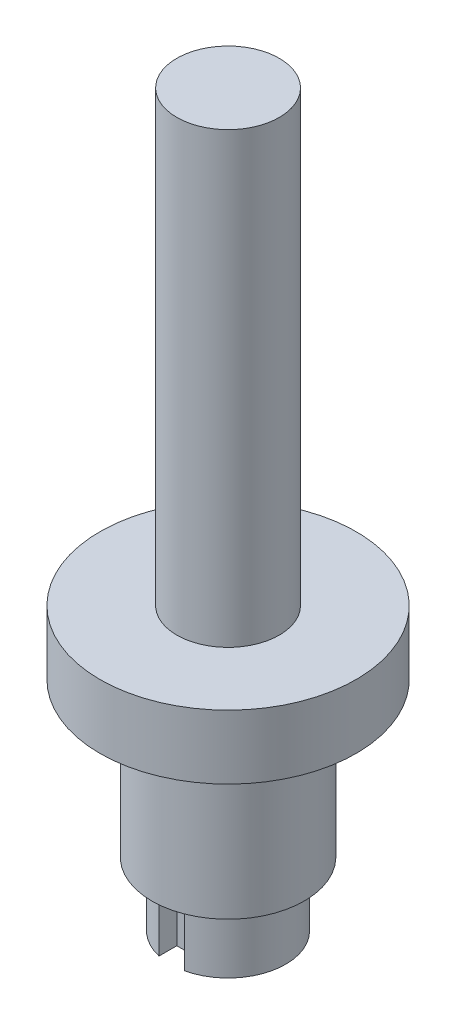
ISO-10303-21;
HEADER;
FILE_DESCRIPTION(('STEP AP214'),'2;1');
FILE_NAME('part.step','',(''),(''),'','','');
FILE_SCHEMA(('AUTOMOTIVE_DESIGN { 1 0 10303 214 1 1 1 1 }'));
ENDSEC;
DATA;
#1=APPLICATION_CONTEXT('core data for automotive mechanical design processes');
#2=APPLICATION_PROTOCOL_DEFINITION('international standard','automotive_design',2000,#1);
#3=PRODUCT_CONTEXT('',#1,'mechanical');
#4=PRODUCT('Part','Part','',(#3));
#5=PRODUCT_RELATED_PRODUCT_CATEGORY('part','',(#4));
#6=PRODUCT_DEFINITION_FORMATION('','',#4);
#7=PRODUCT_DEFINITION_CONTEXT('part definition',#1,'design');
#8=PRODUCT_DEFINITION('design','',#6,#7);
#9=PRODUCT_DEFINITION_SHAPE('','',#8);
#10=(LENGTH_UNIT() NAMED_UNIT(*) SI_UNIT(.MILLI.,.METRE.));
#11=(NAMED_UNIT(*) PLANE_ANGLE_UNIT() SI_UNIT($,.RADIAN.));
#12=(NAMED_UNIT(*) SI_UNIT($,.STERADIAN.) SOLID_ANGLE_UNIT());
#13=UNCERTAINTY_MEASURE_WITH_UNIT(LENGTH_MEASURE(1.E-05),#10,'distance_accuracy_value','');
#14=(GEOMETRIC_REPRESENTATION_CONTEXT(3) GLOBAL_UNCERTAINTY_ASSIGNED_CONTEXT((#13)) GLOBAL_UNIT_ASSIGNED_CONTEXT((#10,
#11,#12)) REPRESENTATION_CONTEXT('',''));
#15=CARTESIAN_POINT('',(0.,0.,0.));
#16=DIRECTION('',(0.,0.,1.));
#17=DIRECTION('',(1.,0.,0.));
#18=AXIS2_PLACEMENT_3D('',#15,#16,#17);
#19=CARTESIAN_POINT('',(0.,5.,0.));
#20=DIRECTION('',(0.,-1.,0.));
#21=DIRECTION('',(0.,0.,-1.));
#22=AXIS2_PLACEMENT_3D('',#19,#20,#21);
#23=CYLINDRICAL_SURFACE('',#22,4.5);
#24=CARTESIAN_POINT('',(0.,0.,0.));
#25=DIRECTION('',(0.,1.,0.));
#26=DIRECTION('',(0.,0.,1.));
#27=AXIS2_PLACEMENT_3D('',#24,#25,#26);
#28=CIRCLE('',#27,4.5);
#29=CARTESIAN_POINT('',(1.,0.,4.38748219369606));
#30=VERTEX_POINT('',#29);
#31=CARTESIAN_POINT('',(-1.,0.,4.38748219369606));
#32=VERTEX_POINT('',#31);
#33=EDGE_CURVE('E51',#30,#32,#28,.T.);
#34=ORIENTED_EDGE('',*,*,#33,.T.);
#35=DIRECTION('',(0.,-1.,0.));
#36=VECTOR('',#35,1.);
#37=CARTESIAN_POINT('',(-1.,5.,4.38748219369606));
#38=LINE('',#37,#36);
#39=CARTESIAN_POINT('',(-1.,5.,4.38748219369606));
#40=VERTEX_POINT('',#39);
#41=EDGE_CURVE('E71',#32,#40,#38,.F.);
#42=ORIENTED_EDGE('',*,*,#41,.T.);
#43=CARTESIAN_POINT('',(0.,5.,0.));
#44=DIRECTION('',(0.,1.,0.));
#45=DIRECTION('',(0.,0.,1.));
#46=AXIS2_PLACEMENT_3D('',#43,#44,#45);
#47=CIRCLE('',#46,4.5);
#48=CARTESIAN_POINT('',(1.,5.,4.38748219369606));
#49=VERTEX_POINT('',#48);
#50=EDGE_CURVE('E11',#49,#40,#47,.T.);
#51=ORIENTED_EDGE('',*,*,#50,.F.);
#52=DIRECTION('',(0.,-1.,0.));
#53=VECTOR('',#52,1.);
#54=CARTESIAN_POINT('',(1.,5.,4.38748219369606));
#55=LINE('',#54,#53);
#56=EDGE_CURVE('E122',#49,#30,#55,.T.);
#57=ORIENTED_EDGE('',*,*,#56,.T.);
#58=EDGE_LOOP('',(#34,#42,#51,#57));
#59=FACE_BOUND('',#58,.T.);
#60=ADVANCED_FACE('F48',(#59),#23,.T.);
#61=CARTESIAN_POINT('',(0.,0.,0.));
#62=DIRECTION('',(0.,1.,0.));
#63=DIRECTION('',(0.,0.,1.));
#64=AXIS2_PLACEMENT_3D('',#61,#62,#63);
#65=PLANE('',#64);
#66=CARTESIAN_POINT('',(0.,0.,0.));
#67=DIRECTION('',(0.,-1.,0.));
#68=DIRECTION('',(0.,0.,-1.));
#69=AXIS2_PLACEMENT_3D('',#66,#67,#68);
#70=CIRCLE('',#69,1.525);
#71=CARTESIAN_POINT('',(0.,0.,-1.525));
#72=VERTEX_POINT('',#71);
#73=EDGE_CURVE('E133',#72,#72,#70,.T.);
#74=ORIENTED_EDGE('',*,*,#73,.F.);
#75=EDGE_LOOP('',(#74));
#76=FACE_BOUND('',#75,.T.);
#77=DIRECTION('',(1.,0.,0.));
#78=VECTOR('',#77,1.);
#79=CARTESIAN_POINT('',(-1.,0.,3.));
#80=LINE('',#79,#78);
#81=CARTESIAN_POINT('',(-1.,0.,3.));
#82=VERTEX_POINT('',#81);
#83=CARTESIAN_POINT('',(1.,0.,3.));
#84=VERTEX_POINT('',#83);
#85=EDGE_CURVE('E63',#82,#84,#80,.T.);
#86=ORIENTED_EDGE('',*,*,#85,.F.);
#87=DIRECTION('',(0.,0.,-1.));
#88=VECTOR('',#87,1.);
#89=CARTESIAN_POINT('',(-1.,0.,6.));
#90=LINE('',#89,#88);
#91=EDGE_CURVE('E89',#32,#82,#90,.T.);
#92=ORIENTED_EDGE('',*,*,#91,.F.);
#93=ORIENTED_EDGE('',*,*,#33,.F.);
#94=DIRECTION('',(0.,0.,1.));
#95=VECTOR('',#94,1.);
#96=CARTESIAN_POINT('',(1.,0.,6.));
#97=LINE('',#96,#95);
#98=EDGE_CURVE('E96',#84,#30,#97,.T.);
#99=ORIENTED_EDGE('',*,*,#98,.F.);
#100=EDGE_LOOP('',(#86,#92,#93,#99));
#101=FACE_BOUND('',#100,.T.);
#102=ADVANCED_FACE('F106',(#76,#101),#65,.F.);
#103=CARTESIAN_POINT('',(0.,17.,0.));
#104=DIRECTION('',(0.,-1.,0.));
#105=DIRECTION('',(0.,0.,-1.));
#106=AXIS2_PLACEMENT_3D('',#103,#104,#105);
#107=CYLINDRICAL_SURFACE('',#106,5.95);
#108=CARTESIAN_POINT('',(0.,17.,0.));
#109=DIRECTION('',(0.,1.,0.));
#110=DIRECTION('',(0.,0.,1.));
#111=AXIS2_PLACEMENT_3D('',#108,#109,#110);
#112=CIRCLE('',#111,5.95);
#113=CARTESIAN_POINT('',(0.,17.,5.95));
#114=VERTEX_POINT('',#113);
#115=EDGE_CURVE('E154',#114,#114,#112,.T.);
#116=ORIENTED_EDGE('',*,*,#115,.F.);
#117=EDGE_LOOP('',(#116));
#118=FACE_BOUND('',#117,.T.);
#119=CARTESIAN_POINT('',(0.,5.,0.));
#120=DIRECTION('',(0.,1.,0.));
#121=DIRECTION('',(0.,0.,1.));
#122=AXIS2_PLACEMENT_3D('',#119,#120,#121);
#123=CIRCLE('',#122,5.95);
#124=CARTESIAN_POINT('',(0.,5.,5.95));
#125=VERTEX_POINT('',#124);
#126=EDGE_CURVE('E150',#125,#125,#123,.T.);
#127=ORIENTED_EDGE('',*,*,#126,.T.);
#128=EDGE_LOOP('',(#127));
#129=FACE_BOUND('',#128,.T.);
#130=ADVANCED_FACE('F162',(#118,#129),#107,.T.);
#131=CARTESIAN_POINT('',(0.,5.,0.));
#132=DIRECTION('',(0.,1.,0.));
#133=DIRECTION('',(0.,0.,1.));
#134=AXIS2_PLACEMENT_3D('',#131,#132,#133);
#135=PLANE('',#134);
#136=ORIENTED_EDGE('',*,*,#126,.F.);
#137=EDGE_LOOP('',(#136));
#138=FACE_BOUND('',#137,.T.);
#139=ORIENTED_EDGE('',*,*,#50,.T.);
#140=DIRECTION('',(0.,0.,-1.));
#141=VECTOR('',#140,1.);
#142=CARTESIAN_POINT('',(-1.,5.,6.));
#143=LINE('',#142,#141);
#144=CARTESIAN_POINT('',(-1.,5.,3.));
#145=VERTEX_POINT('',#144);
#146=EDGE_CURVE('E103',#40,#145,#143,.T.);
#147=ORIENTED_EDGE('',*,*,#146,.T.);
#148=DIRECTION('',(1.,0.,0.));
#149=VECTOR('',#148,1.);
#150=CARTESIAN_POINT('',(-1.,5.,3.));
#151=LINE('',#150,#149);
#152=CARTESIAN_POINT('',(1.,5.,3.));
#153=VERTEX_POINT('',#152);
#154=EDGE_CURVE('E101',#145,#153,#151,.T.);
#155=ORIENTED_EDGE('',*,*,#154,.T.);
#156=DIRECTION('',(0.,0.,1.));
#157=VECTOR('',#156,1.);
#158=CARTESIAN_POINT('',(1.,5.,6.));
#159=LINE('',#158,#157);
#160=EDGE_CURVE('E118',#153,#49,#159,.T.);
#161=ORIENTED_EDGE('',*,*,#160,.T.);
#162=EDGE_LOOP('',(#139,#147,#155,#161));
#163=FACE_BOUND('',#162,.T.);
#164=ADVANCED_FACE('F164',(#138,#163),#135,.F.);
#165=CARTESIAN_POINT('',(0.,22.,0.));
#166=DIRECTION('',(0.,-1.,0.));
#167=DIRECTION('',(0.,0.,-1.));
#168=AXIS2_PLACEMENT_3D('',#165,#166,#167);
#169=CYLINDRICAL_SURFACE('',#168,10.);
#170=CARTESIAN_POINT('',(0.,22.,0.));
#171=DIRECTION('',(0.,1.,0.));
#172=DIRECTION('',(0.,0.,1.));
#173=AXIS2_PLACEMENT_3D('',#170,#171,#172);
#174=CIRCLE('',#173,10.);
#175=CARTESIAN_POINT('',(0.,22.,10.));
#176=VERTEX_POINT('',#175);
#177=EDGE_CURVE('E146',#176,#176,#174,.T.);
#178=ORIENTED_EDGE('',*,*,#177,.F.);
#179=EDGE_LOOP('',(#178));
#180=FACE_BOUND('',#179,.T.);
#181=CARTESIAN_POINT('',(0.,17.,0.));
#182=DIRECTION('',(0.,1.,0.));
#183=DIRECTION('',(0.,0.,1.));
#184=AXIS2_PLACEMENT_3D('',#181,#182,#183);
#185=CIRCLE('',#184,10.);
#186=CARTESIAN_POINT('',(0.,17.,10.));
#187=VERTEX_POINT('',#186);
#188=EDGE_CURVE('E145',#187,#187,#185,.T.);
#189=ORIENTED_EDGE('',*,*,#188,.T.);
#190=EDGE_LOOP('',(#189));
#191=FACE_BOUND('',#190,.T.);
#192=ADVANCED_FACE('F167',(#180,#191),#169,.T.);
#193=CARTESIAN_POINT('',(0.,22.,0.));
#194=DIRECTION('',(0.,1.,0.));
#195=DIRECTION('',(0.,0.,1.));
#196=AXIS2_PLACEMENT_3D('',#193,#194,#195);
#197=PLANE('',#196);
#198=CARTESIAN_POINT('',(0.,22.,0.));
#199=DIRECTION('',(0.,1.,0.));
#200=DIRECTION('',(0.,0.,1.));
#201=AXIS2_PLACEMENT_3D('',#198,#199,#200);
#202=CIRCLE('',#201,4.);
#203=CARTESIAN_POINT('',(0.,22.,4.));
#204=VERTEX_POINT('',#203);
#205=EDGE_CURVE('E112',#204,#204,#202,.T.);
#206=ORIENTED_EDGE('',*,*,#205,.F.);
#207=EDGE_LOOP('',(#206));
#208=FACE_BOUND('',#207,.T.);
#209=ORIENTED_EDGE('',*,*,#177,.T.);
#210=EDGE_LOOP('',(#209));
#211=FACE_BOUND('',#210,.T.);
#212=ADVANCED_FACE('F199',(#208,#211),#197,.T.);
#213=CARTESIAN_POINT('',(0.,17.,0.));
#214=DIRECTION('',(0.,1.,0.));
#215=DIRECTION('',(0.,0.,1.));
#216=AXIS2_PLACEMENT_3D('',#213,#214,#215);
#217=PLANE('',#216);
#218=ORIENTED_EDGE('',*,*,#115,.T.);
#219=EDGE_LOOP('',(#218));
#220=FACE_BOUND('',#219,.T.);
#221=ORIENTED_EDGE('',*,*,#188,.F.);
#222=EDGE_LOOP('',(#221));
#223=FACE_BOUND('',#222,.T.);
#224=ADVANCED_FACE('F201',(#220,#223),#217,.F.);
#225=CARTESIAN_POINT('',(0.,0.,0.));
#226=DIRECTION('',(0.,-1.,0.));
#227=DIRECTION('',(0.,0.,-1.));
#228=AXIS2_PLACEMENT_3D('',#225,#226,#227);
#229=CYLINDRICAL_SURFACE('',#228,1.25);
#230=CARTESIAN_POINT('',(0.,22.,0.));
#231=DIRECTION('',(0.,-1.,0.));
#232=DIRECTION('',(0.,0.,-1.));
#233=AXIS2_PLACEMENT_3D('',#230,#231,#232);
#234=CIRCLE('',#233,1.24999999999999);
#235=CARTESIAN_POINT('',(0.,22.,-1.24999999999999));
#236=VERTEX_POINT('',#235);
#237=EDGE_CURVE('E141',#236,#236,#234,.T.);
#238=ORIENTED_EDGE('',*,*,#237,.F.);
#239=EDGE_LOOP('',(#238));
#240=FACE_BOUND('',#239,.T.);
#241=CARTESIAN_POINT('',(0.,0.275000000000001,0.));
#242=DIRECTION('',(0.,-1.,0.));
#243=DIRECTION('',(0.,0.,-1.));
#244=AXIS2_PLACEMENT_3D('',#241,#242,#243);
#245=CIRCLE('',#244,1.25);
#246=CARTESIAN_POINT('',(0.,0.275000000000001,-1.25));
#247=VERTEX_POINT('',#246);
#248=EDGE_CURVE('E137',#247,#247,#245,.T.);
#249=ORIENTED_EDGE('',*,*,#248,.T.);
#250=EDGE_LOOP('',(#249));
#251=FACE_BOUND('',#250,.T.);
#252=ADVANCED_FACE('F204',(#240,#251),#229,.F.);
#253=CARTESIAN_POINT('',(0.,0.,0.));
#254=DIRECTION('',(0.,-1.,0.));
#255=DIRECTION('',(0.,0.,-1.));
#256=AXIS2_PLACEMENT_3D('',#253,#254,#255);
#257=CONICAL_SURFACE('',#256,1.525,0.785398163397451);
#258=ORIENTED_EDGE('',*,*,#248,.F.);
#259=EDGE_LOOP('',(#258));
#260=FACE_BOUND('',#259,.T.);
#261=ORIENTED_EDGE('',*,*,#73,.T.);
#262=EDGE_LOOP('',(#261));
#263=FACE_BOUND('',#262,.T.);
#264=ADVANCED_FACE('F182',(#260,#263),#257,.F.);
#265=CARTESIAN_POINT('',(-1.,8.60555127546399,6.));
#266=DIRECTION('',(-1.,0.,0.));
#267=DIRECTION('',(0.,0.,1.));
#268=AXIS2_PLACEMENT_3D('',#265,#266,#267);
#269=PLANE('',#268);
#270=ORIENTED_EDGE('',*,*,#91,.T.);
#271=DIRECTION('',(0.,-1.,0.));
#272=VECTOR('',#271,1.);
#273=CARTESIAN_POINT('',(-1.,8.60555127546399,3.));
#274=LINE('',#273,#272);
#275=EDGE_CURVE('E91',#145,#82,#274,.T.);
#276=ORIENTED_EDGE('',*,*,#275,.F.);
#277=ORIENTED_EDGE('',*,*,#146,.F.);
#278=ORIENTED_EDGE('',*,*,#41,.F.);
#279=EDGE_LOOP('',(#270,#276,#277,#278));
#280=FACE_BOUND('',#279,.T.);
#281=ADVANCED_FACE('F90',(#280),#269,.F.);
#282=CARTESIAN_POINT('',(1.,8.60555127546399,6.));
#283=DIRECTION('',(1.,0.,0.));
#284=DIRECTION('',(0.,0.,-1.));
#285=AXIS2_PLACEMENT_3D('',#282,#283,#284);
#286=PLANE('',#285);
#287=ORIENTED_EDGE('',*,*,#160,.F.);
#288=DIRECTION('',(0.,-1.,0.));
#289=VECTOR('',#288,1.);
#290=CARTESIAN_POINT('',(1.,8.60555127546399,3.));
#291=LINE('',#290,#289);
#292=EDGE_CURVE('E123',#153,#84,#291,.T.);
#293=ORIENTED_EDGE('',*,*,#292,.T.);
#294=ORIENTED_EDGE('',*,*,#98,.T.);
#295=ORIENTED_EDGE('',*,*,#56,.F.);
#296=EDGE_LOOP('',(#287,#293,#294,#295));
#297=FACE_BOUND('',#296,.T.);
#298=ADVANCED_FACE('F173',(#297),#286,.F.);
#299=CARTESIAN_POINT('',(-1.,8.60555127546399,3.));
#300=DIRECTION('',(0.,0.,-1.));
#301=DIRECTION('',(-1.,0.,0.));
#302=AXIS2_PLACEMENT_3D('',#299,#300,#301);
#303=PLANE('',#302);
#304=ORIENTED_EDGE('',*,*,#275,.T.);
#305=ORIENTED_EDGE('',*,*,#85,.T.);
#306=ORIENTED_EDGE('',*,*,#292,.F.);
#307=ORIENTED_EDGE('',*,*,#154,.F.);
#308=EDGE_LOOP('',(#304,#305,#306,#307));
#309=FACE_BOUND('',#308,.T.);
#310=ADVANCED_FACE('F99',(#309),#303,.F.);
#311=CARTESIAN_POINT('',(0.,22.,0.));
#312=DIRECTION('',(0.,1.,0.));
#313=DIRECTION('',(0.,0.,1.));
#314=AXIS2_PLACEMENT_3D('',#311,#312,#313);
#315=PLANE('',#314);
#316=ORIENTED_EDGE('',*,*,#237,.T.);
#317=EDGE_LOOP('',(#316));
#318=FACE_BOUND('',#317,.T.);
#319=ADVANCED_FACE('F180',(#318),#315,.F.);
#320=CARTESIAN_POINT('',(0.,57.,0.));
#321=DIRECTION('',(0.,-1.,0.));
#322=DIRECTION('',(0.,0.,-1.));
#323=AXIS2_PLACEMENT_3D('',#320,#321,#322);
#324=CYLINDRICAL_SURFACE('',#323,4.);
#325=CARTESIAN_POINT('',(0.,57.,0.));
#326=DIRECTION('',(0.,1.,0.));
#327=DIRECTION('',(0.,0.,1.));
#328=AXIS2_PLACEMENT_3D('',#325,#326,#327);
#329=CIRCLE('',#328,4.);
#330=CARTESIAN_POINT('',(0.,57.,4.));
#331=VERTEX_POINT('',#330);
#332=EDGE_CURVE('E117',#331,#331,#329,.T.);
#333=ORIENTED_EDGE('',*,*,#332,.F.);
#334=EDGE_LOOP('',(#333));
#335=FACE_BOUND('',#334,.T.);
#336=ORIENTED_EDGE('',*,*,#205,.T.);
#337=EDGE_LOOP('',(#336));
#338=FACE_BOUND('',#337,.T.);
#339=ADVANCED_FACE('F246',(#335,#338),#324,.T.);
#340=CARTESIAN_POINT('',(0.,57.,0.));
#341=DIRECTION('',(0.,1.,0.));
#342=DIRECTION('',(0.,0.,1.));
#343=AXIS2_PLACEMENT_3D('',#340,#341,#342);
#344=PLANE('',#343);
#345=ORIENTED_EDGE('',*,*,#332,.T.);
#346=EDGE_LOOP('',(#345));
#347=FACE_BOUND('',#346,.T.);
#348=ADVANCED_FACE('F256',(#347),#344,.T.);
#349=CLOSED_SHELL('',(#60,#102,#130,#164,#192,#212,#224,#252,#264,#281,#298,#310,#319,#339,#348));
#350=MANIFOLD_SOLID_BREP('B2',#349);
#351=ADVANCED_BREP_SHAPE_REPRESENTATION('',(#18,#350),#14);
#352=SHAPE_DEFINITION_REPRESENTATION(#9,#351);
ENDSEC;
END-ISO-10303-21;
